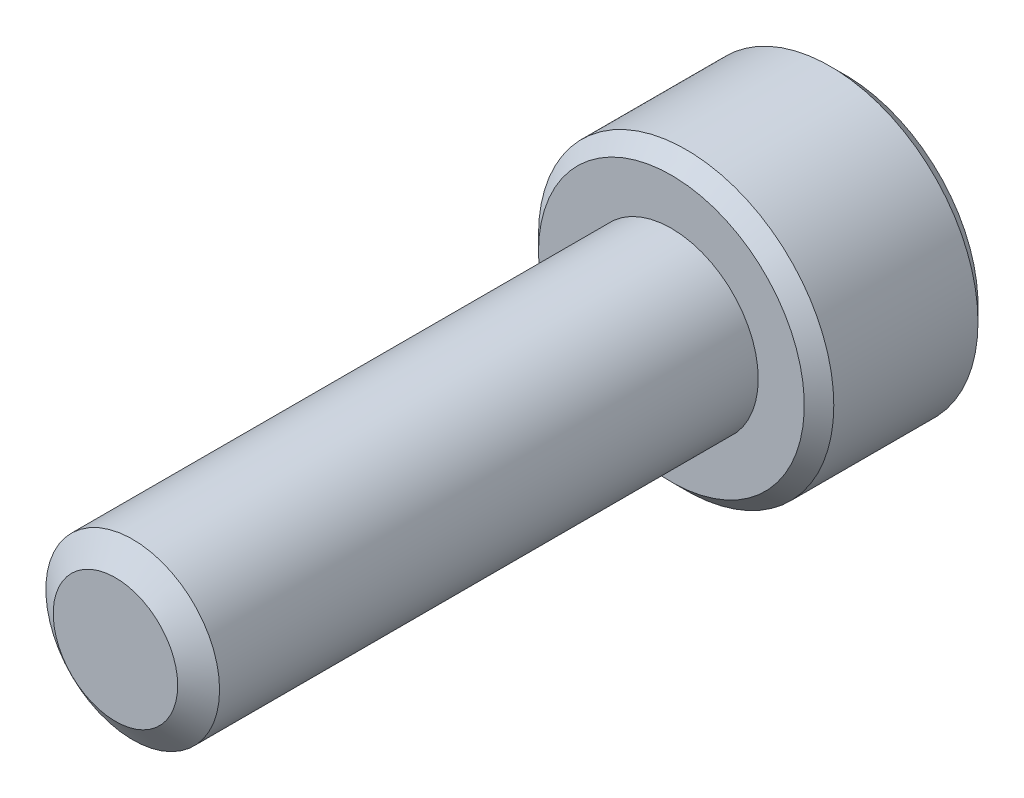
ISO-10303-21;
HEADER;
FILE_DESCRIPTION(('STEP AP214'),'2;1');
FILE_NAME('part.step','',(''),(''),'','','');
FILE_SCHEMA(('AUTOMOTIVE_DESIGN { 1 0 10303 214 1 1 1 1 }'));
ENDSEC;
DATA;
#1=APPLICATION_CONTEXT('core data for automotive mechanical design processes');
#2=APPLICATION_PROTOCOL_DEFINITION('international standard','automotive_design',2000,#1);
#3=PRODUCT_CONTEXT('',#1,'mechanical');
#4=PRODUCT('Part','Part','',(#3));
#5=PRODUCT_RELATED_PRODUCT_CATEGORY('part','',(#4));
#6=PRODUCT_DEFINITION_FORMATION('','',#4);
#7=PRODUCT_DEFINITION_CONTEXT('part definition',#1,'design');
#8=PRODUCT_DEFINITION('design','',#6,#7);
#9=PRODUCT_DEFINITION_SHAPE('','',#8);
#10=(LENGTH_UNIT() NAMED_UNIT(*) SI_UNIT(.MILLI.,.METRE.));
#11=(NAMED_UNIT(*) PLANE_ANGLE_UNIT() SI_UNIT($,.RADIAN.));
#12=(NAMED_UNIT(*) SI_UNIT($,.STERADIAN.) SOLID_ANGLE_UNIT());
#13=UNCERTAINTY_MEASURE_WITH_UNIT(LENGTH_MEASURE(1.E-05),#10,'distance_accuracy_value','');
#14=(GEOMETRIC_REPRESENTATION_CONTEXT(3) GLOBAL_UNCERTAINTY_ASSIGNED_CONTEXT((#13)) GLOBAL_UNIT_ASSIGNED_CONTEXT((#10,
#11,#12)) REPRESENTATION_CONTEXT('',''));
#15=CARTESIAN_POINT('',(0.,0.,0.));
#16=DIRECTION('',(0.,0.,1.));
#17=DIRECTION('',(1.,0.,0.));
#18=AXIS2_PLACEMENT_3D('',#15,#16,#17);
#19=CARTESIAN_POINT('',(0.,0.,-16.));
#20=DIRECTION('',(0.,0.,1.));
#21=DIRECTION('',(1.,0.,0.));
#22=AXIS2_PLACEMENT_3D('',#19,#20,#21);
#23=CYLINDRICAL_SURFACE('',#22,2.5);
#24=CARTESIAN_POINT('',(0.,0.,-16.));
#25=DIRECTION('',(0.,0.,-1.));
#26=DIRECTION('',(-1.,0.,0.));
#27=AXIS2_PLACEMENT_3D('',#24,#25,#26);
#28=CIRCLE('',#27,2.5);
#29=CARTESIAN_POINT('',(-2.5,0.,-16.));
#30=VERTEX_POINT('',#29);
#31=EDGE_CURVE('E212',#30,#30,#28,.F.);
#32=ORIENTED_EDGE('',*,*,#31,.T.);
#33=EDGE_LOOP('',(#32));
#34=FACE_BOUND('',#33,.T.);
#35=CARTESIAN_POINT('',(0.,0.,-0.496211410611025));
#36=DIRECTION('',(0.,0.,1.));
#37=DIRECTION('',(1.,0.,0.));
#38=AXIS2_PLACEMENT_3D('',#35,#36,#37);
#39=CIRCLE('',#38,2.5);
#40=CARTESIAN_POINT('',(2.5,0.,-0.496211410611025));
#41=VERTEX_POINT('',#40);
#42=EDGE_CURVE('E106',#41,#41,#39,.T.);
#43=ORIENTED_EDGE('',*,*,#42,.F.);
#44=EDGE_LOOP('',(#43));
#45=FACE_BOUND('',#44,.T.);
#46=ADVANCED_FACE('F32',(#34,#45),#23,.T.);
#47=CARTESIAN_POINT('',(0.,0.,0.));
#48=DIRECTION('',(0.,0.,-1.));
#49=DIRECTION('',(-1.,0.,0.));
#50=AXIS2_PLACEMENT_3D('',#47,#48,#49);
#51=CONICAL_SURFACE('',#50,1.79133666301317,0.959931088596884);
#52=ORIENTED_EDGE('',*,*,#42,.T.);
#53=EDGE_LOOP('',(#52));
#54=FACE_BOUND('',#53,.T.);
#55=CARTESIAN_POINT('',(0.,0.,0.));
#56=DIRECTION('',(0.,0.,1.));
#57=DIRECTION('',(1.,0.,0.));
#58=AXIS2_PLACEMENT_3D('',#55,#56,#57);
#59=CIRCLE('',#58,1.79133666301317);
#60=CARTESIAN_POINT('',(1.79133666301317,0.,0.));
#61=VERTEX_POINT('',#60);
#62=EDGE_CURVE('E210',#61,#61,#59,.T.);
#63=ORIENTED_EDGE('',*,*,#62,.F.);
#64=EDGE_LOOP('',(#63));
#65=FACE_BOUND('',#64,.T.);
#66=ADVANCED_FACE('F193',(#54,#65),#51,.T.);
#67=CARTESIAN_POINT('',(0.,0.,0.));
#68=DIRECTION('',(0.,0.,1.));
#69=DIRECTION('',(1.,0.,0.));
#70=AXIS2_PLACEMENT_3D('',#67,#68,#69);
#71=PLANE('',#70);
#72=ORIENTED_EDGE('',*,*,#62,.T.);
#73=EDGE_LOOP('',(#72));
#74=FACE_BOUND('',#73,.T.);
#75=ADVANCED_FACE('F190',(#74),#71,.T.);
#76=CARTESIAN_POINT('',(0.,0.,-21.));
#77=DIRECTION('',(0.,0.,1.));
#78=DIRECTION('',(1.,0.,0.));
#79=AXIS2_PLACEMENT_3D('',#76,#77,#78);
#80=CYLINDRICAL_SURFACE('',#79,4.25);
#81=CARTESIAN_POINT('',(0.,0.,-20.575));
#82=DIRECTION('',(0.,0.,-1.));
#83=DIRECTION('',(-1.,0.,0.));
#84=AXIS2_PLACEMENT_3D('',#81,#82,#83);
#85=CIRCLE('',#84,4.25);
#86=CARTESIAN_POINT('',(-4.25,0.,-20.575));
#87=VERTEX_POINT('',#86);
#88=EDGE_CURVE('E40',#87,#87,#85,.F.);
#89=ORIENTED_EDGE('',*,*,#88,.T.);
#90=EDGE_LOOP('',(#89));
#91=FACE_BOUND('',#90,.T.);
#92=CARTESIAN_POINT('',(0.,0.,-16.425));
#93=DIRECTION('',(0.,0.,-1.));
#94=DIRECTION('',(-1.,0.,0.));
#95=AXIS2_PLACEMENT_3D('',#92,#93,#94);
#96=CIRCLE('',#95,4.25);
#97=CARTESIAN_POINT('',(-4.25,0.,-16.425));
#98=VERTEX_POINT('',#97);
#99=EDGE_CURVE('E169',#98,#98,#96,.T.);
#100=ORIENTED_EDGE('',*,*,#99,.T.);
#101=EDGE_LOOP('',(#100));
#102=FACE_BOUND('',#101,.T.);
#103=ADVANCED_FACE('F174',(#91,#102),#80,.T.);
#104=CARTESIAN_POINT('',(0.,0.,-21.));
#105=DIRECTION('',(0.,0.,-1.));
#106=DIRECTION('',(-1.,0.,0.));
#107=AXIS2_PLACEMENT_3D('',#104,#105,#106);
#108=PLANE('',#107);
#109=CARTESIAN_POINT('',(0.,0.,-21.));
#110=DIRECTION('',(0.,0.,-1.));
#111=DIRECTION('',(-1.,0.,0.));
#112=AXIS2_PLACEMENT_3D('',#109,#110,#111);
#113=CIRCLE('',#112,3.82500000000001);
#114=CARTESIAN_POINT('',(-3.82500000000001,0.,-21.));
#115=VERTEX_POINT('',#114);
#116=EDGE_CURVE('E105',#115,#115,#113,.T.);
#117=ORIENTED_EDGE('',*,*,#116,.T.);
#118=EDGE_LOOP('',(#117));
#119=FACE_BOUND('',#118,.T.);
#120=CARTESIAN_POINT('',(0.,0.,-21.));
#121=DIRECTION('',(0.,0.,-1.));
#122=DIRECTION('',(-1.,0.,0.));
#123=AXIS2_PLACEMENT_3D('',#120,#121,#122);
#124=CIRCLE('',#123,2.3094010767585);
#125=CARTESIAN_POINT('',(-2.,1.15470053837925,-21.));
#126=VERTEX_POINT('',#125);
#127=CARTESIAN_POINT('',(0.,2.3094010767585,-21.));
#128=VERTEX_POINT('',#127);
#129=EDGE_CURVE('E86',#126,#128,#124,.T.);
#130=ORIENTED_EDGE('',*,*,#129,.F.);
#131=CARTESIAN_POINT('',(-2.,-1.15470053837925,-21.));
#132=VERTEX_POINT('',#131);
#133=EDGE_CURVE('E46',#132,#126,#124,.T.);
#134=ORIENTED_EDGE('',*,*,#133,.F.);
#135=CARTESIAN_POINT('',(0.,-2.3094010767585,-21.));
#136=VERTEX_POINT('',#135);
#137=EDGE_CURVE('E271',#136,#132,#124,.T.);
#138=ORIENTED_EDGE('',*,*,#137,.F.);
#139=CARTESIAN_POINT('',(2.,-1.15470053837925,-21.));
#140=VERTEX_POINT('',#139);
#141=EDGE_CURVE('E53',#140,#136,#124,.T.);
#142=ORIENTED_EDGE('',*,*,#141,.F.);
#143=CARTESIAN_POINT('',(2.,1.15470053837925,-21.));
#144=VERTEX_POINT('',#143);
#145=EDGE_CURVE('E127',#144,#140,#124,.T.);
#146=ORIENTED_EDGE('',*,*,#145,.F.);
#147=EDGE_CURVE('E95',#128,#144,#124,.T.);
#148=ORIENTED_EDGE('',*,*,#147,.F.);
#149=EDGE_LOOP('',(#130,#134,#138,#142,#146,#148));
#150=FACE_BOUND('',#149,.T.);
#151=ADVANCED_FACE('F126',(#119,#150),#108,.T.);
#152=CARTESIAN_POINT('',(0.,0.,-16.));
#153=DIRECTION('',(0.,0.,-1.));
#154=DIRECTION('',(-1.,0.,0.));
#155=AXIS2_PLACEMENT_3D('',#152,#153,#154);
#156=PLANE('',#155);
#157=CARTESIAN_POINT('',(0.,0.,-16.));
#158=DIRECTION('',(0.,0.,-1.));
#159=DIRECTION('',(-1.,0.,0.));
#160=AXIS2_PLACEMENT_3D('',#157,#158,#159);
#161=CIRCLE('',#160,3.825);
#162=CARTESIAN_POINT('',(-3.825,0.,-16.));
#163=VERTEX_POINT('',#162);
#164=EDGE_CURVE('E11',#163,#163,#161,.F.);
#165=ORIENTED_EDGE('',*,*,#164,.T.);
#166=EDGE_LOOP('',(#165));
#167=FACE_BOUND('',#166,.T.);
#168=ORIENTED_EDGE('',*,*,#31,.F.);
#169=EDGE_LOOP('',(#168));
#170=FACE_BOUND('',#169,.T.);
#171=ADVANCED_FACE('F183',(#167,#170),#156,.F.);
#172=CARTESIAN_POINT('',(0.,0.,-21.));
#173=DIRECTION('',(0.,0.,-1.));
#174=DIRECTION('',(-1.,0.,0.));
#175=AXIS2_PLACEMENT_3D('',#172,#173,#174);
#176=CONICAL_SURFACE('',#175,2.3094010767585,0.78539816339745);
#177=ORIENTED_EDGE('',*,*,#147,.T.);
#178=CARTESIAN_POINT('',(-0.000199999999999456,2.30951654681234,-21.0001154787137));
#179=CARTESIAN_POINT('',(0.0685530340307063,2.26982196410711,-20.9604530902256));
#180=CARTESIAN_POINT('',(0.138455742135513,2.22946361676571,-20.9231199822842));
#181=CARTESIAN_POINT('',(0.280995244550437,2.1471683966763,-20.8547636851361));
#182=CARTESIAN_POINT('',(0.353645597565359,2.10522369580642,-20.8237785337372));
#183=CARTESIAN_POINT('',(0.500141601053971,2.02064418875706,-20.7707002165441));
#184=CARTESIAN_POINT('',(0.573949935246294,1.97803092714269,-20.7484736271766));
#185=CARTESIAN_POINT('',(0.723191631835263,1.89186619344273,-20.7142288166751));
#186=CARTESIAN_POINT('',(0.79862043391815,1.84831735425552,-20.7021850291441));
#187=CARTESIAN_POINT('',(0.928615500671078,1.7732646674724,-20.6913185119056));
#188=CARTESIAN_POINT('',(0.983013783970107,1.74185780396625,-20.68970975361));
#189=CARTESIAN_POINT('',(1.09172145551969,1.67909540053412,-20.6924188775987));
#190=CARTESIAN_POINT('',(1.14603080592134,1.64773988246021,-20.696738837758));
#191=CARTESIAN_POINT('',(1.25413672758934,1.5853248994842,-20.7110595674099));
#192=CARTESIAN_POINT('',(1.30793265655479,1.55426580541469,-20.721066692762));
#193=CARTESIAN_POINT('',(1.41459426230557,1.49268469862228,-20.7462124302497));
#194=CARTESIAN_POINT('',(1.46746001007071,1.46216264491917,-20.7613506490422));
#195=CARTESIAN_POINT('',(1.60287973308984,1.38397803138049,-20.8062945034292));
#196=CARTESIAN_POINT('',(1.68459383484948,1.33680037273297,-20.8394888394258));
#197=CARTESIAN_POINT('',(1.8047470372578,1.26742988897853,-20.8955258231714));
#198=CARTESIAN_POINT('',(1.84434285210918,1.24456923461531,-20.9152147029469));
#199=CARTESIAN_POINT('',(1.92280095888787,1.19927142554652,-20.9563873183649));
#200=CARTESIAN_POINT('',(1.96166368359374,1.17683402097614,-20.9778699516512));
#201=CARTESIAN_POINT('',(2.0002,1.15458506832541,-21.0001154787137));
#202=B_SPLINE_CURVE_WITH_KNOTS('',3,(#178,#179,#180,#181,#182,#183,#184,#185,#186,#187,#188,
#189,#190,#191,#192,#193,#194,#195,#196,#197,#198,#199,#200,#201),.UNSPECIFIED.,.F.,.F.,(4,2,2,
2,2,2,2,2,2,2,2,4),(0.,0.266420613771064,0.534393751523387,0.798110374376911,1.06116288956936,
1.24939906803721,1.43770123566247,1.62621426093931,1.81471283831913,2.11415604834144,
2.2634717071779,2.41269626969771),.UNSPECIFIED.);
#203=EDGE_CURVE('E100',#128,#144,#202,.T.);
#204=ORIENTED_EDGE('',*,*,#203,.F.);
#205=EDGE_LOOP('',(#177,#204));
#206=FACE_BOUND('',#205,.T.);
#207=ADVANCED_FACE('F101',(#206),#176,.F.);
#208=ORIENTED_EDGE('',*,*,#145,.T.);
#209=CARTESIAN_POINT('',(2.,-2.30294417292923,-21.7407713550277));
#210=CARTESIAN_POINT('',(2.,-2.24687002663712,-21.698443273626));
#211=CARTESIAN_POINT('',(2.,-2.19048190536959,-21.6565251568643));
#212=CARTESIAN_POINT('',(2.,-2.07695390496424,-21.573690417861));
#213=CARTESIAN_POINT('',(2.,-2.01981384066454,-21.5327740496681));
#214=CARTESIAN_POINT('',(2.,-1.90424016804776,-21.4518334520186));
#215=CARTESIAN_POINT('',(2.,-1.8457999674391,-21.4118185915599));
#216=CARTESIAN_POINT('',(2.,-1.7279274546176,-21.3332889936643));
#217=CARTESIAN_POINT('',(2.,-1.66849521292324,-21.2947741502431));
#218=CARTESIAN_POINT('',(2.,-1.4816299571002,-21.1776406516043));
#219=CARTESIAN_POINT('',(2.,-1.35220318163536,-21.1021459017296));
#220=CARTESIAN_POINT('',(2.,-1.08689521592924,-20.9640493509944));
#221=CARTESIAN_POINT('',(2.,-0.95103776393819,-20.9014040859035));
#222=CARTESIAN_POINT('',(2.,-0.747111912259407,-20.8247635438751));
#223=CARTESIAN_POINT('',(2.,-0.682064034147874,-20.8027671799191));
#224=CARTESIAN_POINT('',(2.,-0.55039810329475,-20.7639966876601));
#225=CARTESIAN_POINT('',(2.,-0.483779942722474,-20.7472229191212));
#226=CARTESIAN_POINT('',(2.,-0.350484328847653,-20.7200482578844));
#227=CARTESIAN_POINT('',(2.,-0.283829489364783,-20.7095381767417));
#228=CARTESIAN_POINT('',(2.,-0.149806987139374,-20.6950960855449));
#229=CARTESIAN_POINT('',(2.,-0.0824394489341194,-20.6911629447331));
#230=CARTESIAN_POINT('',(2.,0.0499055622944926,-20.6901664769337));
#231=CARTESIAN_POINT('',(2.,0.114881285143175,-20.6928596448504));
#232=CARTESIAN_POINT('',(2.,0.244275921482763,-20.7044300704227));
#233=CARTESIAN_POINT('',(2.,0.308694780266756,-20.7133079288332));
#234=CARTESIAN_POINT('',(2.,0.437599788610707,-20.7369136592962));
#235=CARTESIAN_POINT('',(2.,0.502067428644597,-20.7517410834465));
#236=CARTESIAN_POINT('',(2.,0.629594322598307,-20.786457883628));
#237=CARTESIAN_POINT('',(2.,0.692653693883152,-20.8063468361063));
#238=CARTESIAN_POINT('',(2.,0.891187889210546,-20.8764469792562));
#239=CARTESIAN_POINT('',(2.,1.02383545707306,-20.9346418003215));
#240=CARTESIAN_POINT('',(2.,1.28290932150074,-21.0640305754596));
#241=CARTESIAN_POINT('',(2.,1.40931112587571,-21.1352712314148));
#242=CARTESIAN_POINT('',(2.,1.59200441438963,-21.2464419918747));
#243=CARTESIAN_POINT('',(2.,1.65027549026191,-21.2831821903374));
#244=CARTESIAN_POINT('',(2.,1.76581760389243,-21.3582145141838));
#245=CARTESIAN_POINT('',(2.,1.82308856543105,-21.396506757118));
#246=CARTESIAN_POINT('',(2.,1.93629654762084,-21.4740422640812));
#247=CARTESIAN_POINT('',(2.,1.99224062500539,-21.5132752761336));
#248=CARTESIAN_POINT('',(2.,2.103364240299,-21.5927788307365));
#249=CARTESIAN_POINT('',(2.,2.15854398422469,-21.6330490850006));
#250=CARTESIAN_POINT('',(2.,2.21340370692659,-21.6737442381459));
#251=B_SPLINE_CURVE_WITH_KNOTS('',3,(#209,#210,#211,#212,#213,#214,#215,#216,#217,#218,#219,
#220,#221,#222,#223,#224,#225,#226,#227,#228,#229,#230,#231,#232,#233,#234,#235,#236,#237,#238,
#239,#240,#241,#242,#243,#244,#245,#246,#247,#248,#249,#250),.UNSPECIFIED.,.F.,.F.,(4,2,2,2,2,2,
2,2,2,2,2,2,2,2,2,2,2,2,2,2,4),(0.,0.210772731976891,0.421598374658589,0.634057554623487,
0.846501695870171,1.29562155455624,1.74319622821645,1.94902062110207,2.15485918928326,
2.35699582502635,2.5590977043214,2.75388435553556,2.94868993014815,3.14690093452586,
3.34509535789702,3.77838155837653,4.21325029921625,4.41989056685647,4.62654651460921,
4.8315237711129,5.03644465914085),.UNSPECIFIED.);
#252=EDGE_CURVE('E94',#144,#140,#251,.F.);
#253=ORIENTED_EDGE('',*,*,#252,.F.);
#254=EDGE_LOOP('',(#208,#253));
#255=FACE_BOUND('',#254,.T.);
#256=ADVANCED_FACE('F277',(#255),#176,.F.);
#257=ORIENTED_EDGE('',*,*,#141,.T.);
#258=CARTESIAN_POINT('',(2.0002,-1.15458506832541,-21.0001154787137));
#259=CARTESIAN_POINT('',(1.93144696596929,-1.19427965103064,-20.9604530902256));
#260=CARTESIAN_POINT('',(1.86154425786449,-1.23463799837204,-20.9231199822842));
#261=CARTESIAN_POINT('',(1.71900475544956,-1.31693321846145,-20.8547636851361));
#262=CARTESIAN_POINT('',(1.64635440243464,-1.35887791933134,-20.8237785337372));
#263=CARTESIAN_POINT('',(1.49985839894603,-1.44345742638069,-20.7707002165441));
#264=CARTESIAN_POINT('',(1.42605006475371,-1.48607068799507,-20.7484736271766));
#265=CARTESIAN_POINT('',(1.27680836816474,-1.57223542169503,-20.7142288166751));
#266=CARTESIAN_POINT('',(1.20137956608185,-1.61578426088223,-20.7021850291441));
#267=CARTESIAN_POINT('',(1.07138449932892,-1.69083694766536,-20.6913185119056));
#268=CARTESIAN_POINT('',(1.01698621602989,-1.72224381117151,-20.68970975361));
#269=CARTESIAN_POINT('',(0.908278544480308,-1.78500621460364,-20.6924188775987));
#270=CARTESIAN_POINT('',(0.853969194078662,-1.81636173267754,-20.696738837758));
#271=CARTESIAN_POINT('',(0.745863272410663,-1.87877671565355,-20.7110595674099));
#272=CARTESIAN_POINT('',(0.692067343445209,-1.90983580972306,-20.721066692762));
#273=CARTESIAN_POINT('',(0.585405737694428,-1.97141691651547,-20.7462124302497));
#274=CARTESIAN_POINT('',(0.532539989929289,-2.00193897021859,-20.7613506490422));
#275=CARTESIAN_POINT('',(0.397120266910156,-2.08012358375727,-20.8062945034292));
#276=CARTESIAN_POINT('',(0.315406165150522,-2.12730124240478,-20.8394888394258));
#277=CARTESIAN_POINT('',(0.195252962742198,-2.19667172615922,-20.8955258231714));
#278=CARTESIAN_POINT('',(0.155657147890823,-2.21953238052245,-20.9152147029469));
#279=CARTESIAN_POINT('',(0.0771990411121276,-2.26483018959124,-20.9563873183649));
#280=CARTESIAN_POINT('',(0.0383363164062597,-2.28726759416161,-20.9778699516512));
#281=CARTESIAN_POINT('',(-0.000199999999999433,-2.30951654681234,-21.0001154787137));
#282=B_SPLINE_CURVE_WITH_KNOTS('',3,(#258,#259,#260,#261,#262,#263,#264,#265,#266,#267,#268,
#269,#270,#271,#272,#273,#274,#275,#276,#277,#278,#279,#280,#281),.UNSPECIFIED.,.F.,.F.,(4,2,2,
2,2,2,2,2,2,2,2,4),(0.,0.266420613771063,0.534393751523389,0.798110374376914,1.06116288956936,
1.24939906803722,1.43770123566247,1.62621426093932,1.81471283831913,2.11415604834145,
2.26347170717791,2.41269626969771),.UNSPECIFIED.);
#283=EDGE_CURVE('E137',#140,#136,#282,.T.);
#284=ORIENTED_EDGE('',*,*,#283,.F.);
#285=EDGE_LOOP('',(#257,#284));
#286=FACE_BOUND('',#285,.T.);
#287=ADVANCED_FACE('F274',(#286),#176,.F.);
#288=ORIENTED_EDGE('',*,*,#137,.T.);
#289=CARTESIAN_POINT('',(0.00020000000000056,-2.30951654681234,-21.0001154787137));
#290=CARTESIAN_POINT('',(-0.0685530340307054,-2.26982196410711,-20.9604530902256));
#291=CARTESIAN_POINT('',(-0.138455742135511,-2.22946361676572,-20.9231199822842));
#292=CARTESIAN_POINT('',(-0.280995244550436,-2.1471683966763,-20.8547636851361));
#293=CARTESIAN_POINT('',(-0.353645597565358,-2.10522369580642,-20.8237785337372));
#294=CARTESIAN_POINT('',(-0.50014160105397,-2.02064418875706,-20.7707002165441));
#295=CARTESIAN_POINT('',(-0.573949935246293,-1.97803092714269,-20.7484736271766));
#296=CARTESIAN_POINT('',(-0.723191631835262,-1.89186619344273,-20.7142288166751));
#297=CARTESIAN_POINT('',(-0.79862043391815,-1.84831735425552,-20.7021850291441));
#298=CARTESIAN_POINT('',(-0.928615500671077,-1.7732646674724,-20.6913185119056));
#299=CARTESIAN_POINT('',(-0.983013783970107,-1.74185780396625,-20.68970975361));
#300=CARTESIAN_POINT('',(-1.09172145551969,-1.67909540053412,-20.6924188775987));
#301=CARTESIAN_POINT('',(-1.14603080592134,-1.64773988246022,-20.696738837758));
#302=CARTESIAN_POINT('',(-1.25413672758934,-1.5853248994842,-20.7110595674099));
#303=CARTESIAN_POINT('',(-1.30793265655479,-1.55426580541469,-20.721066692762));
#304=CARTESIAN_POINT('',(-1.41459426230557,-1.49268469862228,-20.7462124302497));
#305=CARTESIAN_POINT('',(-1.46746001007071,-1.46216264491917,-20.7613506490422));
#306=CARTESIAN_POINT('',(-1.60287973308984,-1.38397803138049,-20.8062945034292));
#307=CARTESIAN_POINT('',(-1.68459383484948,-1.33680037273297,-20.8394888394258));
#308=CARTESIAN_POINT('',(-1.8047470372578,-1.26742988897853,-20.8955258231714));
#309=CARTESIAN_POINT('',(-1.84434285210918,-1.24456923461531,-20.9152147029469));
#310=CARTESIAN_POINT('',(-1.92280095888787,-1.19927142554652,-20.9563873183649));
#311=CARTESIAN_POINT('',(-1.96166368359374,-1.17683402097614,-20.9778699516512));
#312=CARTESIAN_POINT('',(-2.0002,-1.15458506832541,-21.0001154787137));
#313=B_SPLINE_CURVE_WITH_KNOTS('',3,(#289,#290,#291,#292,#293,#294,#295,#296,#297,#298,#299,
#300,#301,#302,#303,#304,#305,#306,#307,#308,#309,#310,#311,#312),.UNSPECIFIED.,.F.,.F.,(4,2,2,
2,2,2,2,2,2,2,2,4),(0.,0.266420613771064,0.534393751523389,0.798110374376913,1.06116288956936,
1.24939906803721,1.43770123566247,1.62621426093931,1.81471283831913,2.11415604834145,
2.2634717071779,2.41269626969771),.UNSPECIFIED.);
#314=EDGE_CURVE('E248',#136,#132,#313,.T.);
#315=ORIENTED_EDGE('',*,*,#314,.F.);
#316=EDGE_LOOP('',(#288,#315));
#317=FACE_BOUND('',#316,.T.);
#318=ADVANCED_FACE('F273',(#317),#176,.F.);
#319=ORIENTED_EDGE('',*,*,#133,.T.);
#320=CARTESIAN_POINT('',(-2.,-2.3029441732643,-21.7407713552807));
#321=CARTESIAN_POINT('',(-2.,-2.24687002696278,-21.6984432738692));
#322=CARTESIAN_POINT('',(-2.,-2.19048190568582,-21.6565251570978));
#323=CARTESIAN_POINT('',(-2.,-2.07695390526152,-21.5736904180751));
#324=CARTESIAN_POINT('',(-2.,-2.01981384095229,-21.5327740498725));
#325=CARTESIAN_POINT('',(-2.,-1.90424016831613,-21.4518334522036));
#326=CARTESIAN_POINT('',(-2.,-1.84579996769763,-21.4118185917352));
#327=CARTESIAN_POINT('',(-2.,-1.72792745485625,-21.3332889938203));
#328=CARTESIAN_POINT('',(-2.,-1.66849521315186,-21.2947741503895));
#329=CARTESIAN_POINT('',(-2.,-1.48162995729573,-21.1776406517203));
#330=CARTESIAN_POINT('',(-2.,-1.35220318180736,-21.1021459018253));
#331=CARTESIAN_POINT('',(-2.,-1.08689521605219,-20.9640493510523));
#332=CARTESIAN_POINT('',(-2.,-0.951037764035625,-20.901404085944));
#333=CARTESIAN_POINT('',(-2.,-0.747111912337646,-20.8247635439028));
#334=CARTESIAN_POINT('',(-2.,-0.682064034234151,-20.8027671799472));
#335=CARTESIAN_POINT('',(-2.,-0.550398103397367,-20.7639966876876));
#336=CARTESIAN_POINT('',(-2.,-0.483779942833392,-20.7472229191476));
#337=CARTESIAN_POINT('',(-2.,-0.3504843289749,-20.7200482579067));
#338=CARTESIAN_POINT('',(-2.,-0.283829489500055,-20.709538176761));
#339=CARTESIAN_POINT('',(-2.,-0.149806987290425,-20.6950960855565));
#340=CARTESIAN_POINT('',(-2.,-0.0824394490929252,-20.6911629447399));
#341=CARTESIAN_POINT('',(-2.,0.0499055621213776,-20.6901664769296));
#342=CARTESIAN_POINT('',(-2.,0.114881284963486,-20.6928596448403));
#343=CARTESIAN_POINT('',(-2.,0.244275921290585,-20.7044300703996));
#344=CARTESIAN_POINT('',(-2.,0.308694780068662,-20.7133079288031));
#345=CARTESIAN_POINT('',(-2.,0.437599788400935,-20.7369136592514));
#346=CARTESIAN_POINT('',(-2.,0.50206742842908,-20.7517410833941));
#347=CARTESIAN_POINT('',(-2.,0.629594322371856,-20.78645788356));
#348=CARTESIAN_POINT('',(-2.,0.69265369365151,-20.8063468360305));
#349=CARTESIAN_POINT('',(-2.,0.891187888928464,-20.8764469791434));
#350=CARTESIAN_POINT('',(-2.,1.02383545674826,-20.9346418001747));
#351=CARTESIAN_POINT('',(-2.,1.28290932109378,-21.0640305752409));
#352=CARTESIAN_POINT('',(-2.,1.40931112542932,-21.1352712311583));
#353=CARTESIAN_POINT('',(-2.,1.59200441388854,-21.2464419915627));
#354=CARTESIAN_POINT('',(-2.,1.65027548974481,-21.2831821900083));
#355=CARTESIAN_POINT('',(-2.,1.76581760334354,-21.3582145138205));
#356=CARTESIAN_POINT('',(-2.,1.82308856486638,-21.3965067567377));
#357=CARTESIAN_POINT('',(-2.,1.93629654702499,-21.4740422636668));
#358=CARTESIAN_POINT('',(-2.,1.99224062439414,-21.5132752757022));
#359=CARTESIAN_POINT('',(-2.,2.10336423965704,-21.5927788302713));
#360=CARTESIAN_POINT('',(-2.,2.15854398356743,-21.6330490845185));
#361=CARTESIAN_POINT('',(-2.,2.21340370625406,-21.6737442376469));
#362=B_SPLINE_CURVE_WITH_KNOTS('',3,(#320,#321,#322,#323,#324,#325,#326,#327,#328,#329,#330,
#331,#332,#333,#334,#335,#336,#337,#338,#339,#340,#341,#342,#343,#344,#345,#346,#347,#348,#349,
#350,#351,#352,#353,#354,#355,#356,#357,#358,#359,#360,#361),.UNSPECIFIED.,.F.,.F.,(4,2,2,2,2,2,
2,2,2,2,2,2,2,2,2,2,2,2,2,2,4),(0.,0.210772732017009,0.421598374738837,0.634057554744618,
0.846501696032178,1.29562155480993,1.74319622856096,1.94902062142334,2.15485918958132,
2.35699582530216,2.55909770457495,2.75388435576874,2.94868993036093,3.14690093471669,
3.34509535806591,3.77838155838771,4.21325029906866,4.41989056664096,4.62654651432578,
4.83152377076247,5.03644465872344),.UNSPECIFIED.);
#363=EDGE_CURVE('E116',#132,#126,#362,.T.);
#364=ORIENTED_EDGE('',*,*,#363,.F.);
#365=EDGE_LOOP('',(#319,#364));
#366=FACE_BOUND('',#365,.T.);
#367=ADVANCED_FACE('F286',(#366),#176,.F.);
#368=ORIENTED_EDGE('',*,*,#129,.T.);
#369=CARTESIAN_POINT('',(-2.0002,1.15458506832541,-21.0001154787137));
#370=CARTESIAN_POINT('',(-1.93144696596929,1.19427965103064,-20.9604530902256));
#371=CARTESIAN_POINT('',(-1.86154425786449,1.23463799837204,-20.9231199822842));
#372=CARTESIAN_POINT('',(-1.71900475544956,1.31693321846145,-20.8547636851361));
#373=CARTESIAN_POINT('',(-1.64635440243464,1.35887791933134,-20.8237785337372));
#374=CARTESIAN_POINT('',(-1.49985839894603,1.44345742638069,-20.7707002165441));
#375=CARTESIAN_POINT('',(-1.42605006475371,1.48607068799507,-20.7484736271766));
#376=CARTESIAN_POINT('',(-1.27680836816474,1.57223542169503,-20.7142288166751));
#377=CARTESIAN_POINT('',(-1.20137956608185,1.61578426088223,-20.7021850291441));
#378=CARTESIAN_POINT('',(-1.07138449932892,1.69083694766536,-20.6913185119056));
#379=CARTESIAN_POINT('',(-1.01698621602989,1.72224381117151,-20.68970975361));
#380=CARTESIAN_POINT('',(-0.908278544480308,1.78500621460364,-20.6924188775987));
#381=CARTESIAN_POINT('',(-0.853969194078662,1.81636173267754,-20.696738837758));
#382=CARTESIAN_POINT('',(-0.745863272410663,1.87877671565355,-20.7110595674099));
#383=CARTESIAN_POINT('',(-0.692067343445209,1.90983580972306,-20.721066692762));
#384=CARTESIAN_POINT('',(-0.585405737694428,1.97141691651547,-20.7462124302497));
#385=CARTESIAN_POINT('',(-0.532539989929288,2.00193897021859,-20.7613506490422));
#386=CARTESIAN_POINT('',(-0.397120266910157,2.08012358375727,-20.8062945034292));
#387=CARTESIAN_POINT('',(-0.315406165150521,2.12730124240478,-20.8394888394258));
#388=CARTESIAN_POINT('',(-0.195252962742198,2.19667172615922,-20.8955258231714));
#389=CARTESIAN_POINT('',(-0.155657147890824,2.21953238052245,-20.9152147029469));
#390=CARTESIAN_POINT('',(-0.0771990411121297,2.26483018959123,-20.9563873183649));
#391=CARTESIAN_POINT('',(-0.0383363164062612,2.28726759416161,-20.9778699516512));
#392=CARTESIAN_POINT('',(0.000199999999999579,2.30951654681234,-21.0001154787137));
#393=B_SPLINE_CURVE_WITH_KNOTS('',3,(#369,#370,#371,#372,#373,#374,#375,#376,#377,#378,#379,
#380,#381,#382,#383,#384,#385,#386,#387,#388,#389,#390,#391,#392),.UNSPECIFIED.,.F.,.F.,(4,2,2,
2,2,2,2,2,2,2,2,4),(0.,0.266420613771062,0.534393751523389,0.798110374376914,1.06116288956936,
1.24939906803722,1.43770123566247,1.62621426093932,1.81471283831913,2.11415604834145,
2.2634717071779,2.41269626969771),.UNSPECIFIED.);
#394=EDGE_CURVE('E90',#126,#128,#393,.T.);
#395=ORIENTED_EDGE('',*,*,#394,.F.);
#396=EDGE_LOOP('',(#368,#395));
#397=FACE_BOUND('',#396,.T.);
#398=ADVANCED_FACE('F88',(#397),#176,.F.);
#399=CARTESIAN_POINT('',(2.,3.46410161513775,-18.));
#400=DIRECTION('',(0.,0.,-1.));
#401=DIRECTION('',(-1.,0.,0.));
#402=AXIS2_PLACEMENT_3D('',#399,#400,#401);
#403=PLANE('',#402);
#404=DIRECTION('',(0.866025403784439,0.5,0.));
#405=VECTOR('',#404,1.);
#406=CARTESIAN_POINT('',(-2.,1.15470053837925,-18.));
#407=LINE('',#406,#405);
#408=CARTESIAN_POINT('',(-2.,1.15470053837925,-18.));
#409=VERTEX_POINT('',#408);
#410=CARTESIAN_POINT('',(0.,2.3094010767585,-18.));
#411=VERTEX_POINT('',#410);
#412=EDGE_CURVE('E115',#409,#411,#407,.T.);
#413=ORIENTED_EDGE('',*,*,#412,.T.);
#414=DIRECTION('',(0.866025403784439,-0.5,0.));
#415=VECTOR('',#414,1.);
#416=CARTESIAN_POINT('',(0.,2.3094010767585,-18.));
#417=LINE('',#416,#415);
#418=CARTESIAN_POINT('',(2.,1.15470053837925,-18.));
#419=VERTEX_POINT('',#418);
#420=EDGE_CURVE('E120',#411,#419,#417,.T.);
#421=ORIENTED_EDGE('',*,*,#420,.T.);
#422=DIRECTION('',(0.,-1.,0.));
#423=VECTOR('',#422,1.);
#424=CARTESIAN_POINT('',(2.,1.15470053837925,-18.));
#425=LINE('',#424,#423);
#426=CARTESIAN_POINT('',(2.,-1.15470053837925,-18.));
#427=VERTEX_POINT('',#426);
#428=EDGE_CURVE('E234',#419,#427,#425,.T.);
#429=ORIENTED_EDGE('',*,*,#428,.T.);
#430=DIRECTION('',(-0.866025403784439,-0.5,0.));
#431=VECTOR('',#430,1.);
#432=CARTESIAN_POINT('',(2.,-1.15470053837925,-18.));
#433=LINE('',#432,#431);
#434=CARTESIAN_POINT('',(0.,-2.3094010767585,-18.));
#435=VERTEX_POINT('',#434);
#436=EDGE_CURVE('E231',#427,#435,#433,.T.);
#437=ORIENTED_EDGE('',*,*,#436,.T.);
#438=DIRECTION('',(-0.866025403784439,0.5,0.));
#439=VECTOR('',#438,1.);
#440=CARTESIAN_POINT('',(0.,-2.3094010767585,-18.));
#441=LINE('',#440,#439);
#442=CARTESIAN_POINT('',(-2.,-1.15470053837925,-18.));
#443=VERTEX_POINT('',#442);
#444=EDGE_CURVE('E228',#435,#443,#441,.T.);
#445=ORIENTED_EDGE('',*,*,#444,.T.);
#446=DIRECTION('',(0.,1.,0.));
#447=VECTOR('',#446,1.);
#448=CARTESIAN_POINT('',(-2.,-1.15470053837925,-18.));
#449=LINE('',#448,#447);
#450=EDGE_CURVE('E123',#443,#409,#449,.T.);
#451=ORIENTED_EDGE('',*,*,#450,.T.);
#452=EDGE_LOOP('',(#413,#421,#429,#437,#445,#451));
#453=FACE_BOUND('',#452,.T.);
#454=ADVANCED_FACE('F157',(#453),#403,.T.);
#455=CARTESIAN_POINT('',(0.,2.3094010767585,-18.));
#456=DIRECTION('',(0.5,0.866025403784439,0.));
#457=DIRECTION('',(-0.866025403784439,0.5,0.));
#458=AXIS2_PLACEMENT_3D('',#455,#456,#457);
#459=PLANE('',#458);
#460=DIRECTION('',(0.,0.,-1.));
#461=VECTOR('',#460,1.);
#462=CARTESIAN_POINT('',(0.,2.3094010767585,-18.));
#463=LINE('',#462,#461);
#464=EDGE_CURVE('E112',#411,#128,#463,.T.);
#465=ORIENTED_EDGE('',*,*,#464,.T.);
#466=ORIENTED_EDGE('',*,*,#203,.T.);
#467=DIRECTION('',(0.,0.,-1.));
#468=VECTOR('',#467,1.);
#469=CARTESIAN_POINT('',(2.,1.15470053837925,-18.));
#470=LINE('',#469,#468);
#471=EDGE_CURVE('E122',#419,#144,#470,.T.);
#472=ORIENTED_EDGE('',*,*,#471,.F.);
#473=ORIENTED_EDGE('',*,*,#420,.F.);
#474=EDGE_LOOP('',(#465,#466,#472,#473));
#475=FACE_BOUND('',#474,.T.);
#476=ADVANCED_FACE('F118',(#475),#459,.F.);
#477=CARTESIAN_POINT('',(2.,1.15470053837925,-18.));
#478=DIRECTION('',(1.,0.,0.));
#479=DIRECTION('',(0.,0.,-1.));
#480=AXIS2_PLACEMENT_3D('',#477,#478,#479);
#481=PLANE('',#480);
#482=ORIENTED_EDGE('',*,*,#471,.T.);
#483=ORIENTED_EDGE('',*,*,#252,.T.);
#484=DIRECTION('',(0.,0.,-1.));
#485=VECTOR('',#484,1.);
#486=CARTESIAN_POINT('',(2.,-1.15470053837925,-18.));
#487=LINE('',#486,#485);
#488=EDGE_CURVE('E217',#427,#140,#487,.T.);
#489=ORIENTED_EDGE('',*,*,#488,.F.);
#490=ORIENTED_EDGE('',*,*,#428,.F.);
#491=EDGE_LOOP('',(#482,#483,#489,#490));
#492=FACE_BOUND('',#491,.T.);
#493=ADVANCED_FACE('F146',(#492),#481,.F.);
#494=CARTESIAN_POINT('',(2.,-1.15470053837925,-18.));
#495=DIRECTION('',(0.5,-0.866025403784439,0.));
#496=DIRECTION('',(0.866025403784439,0.5,0.));
#497=AXIS2_PLACEMENT_3D('',#494,#495,#496);
#498=PLANE('',#497);
#499=ORIENTED_EDGE('',*,*,#488,.T.);
#500=ORIENTED_EDGE('',*,*,#283,.T.);
#501=DIRECTION('',(0.,0.,-1.));
#502=VECTOR('',#501,1.);
#503=CARTESIAN_POINT('',(0.,-2.3094010767585,-18.));
#504=LINE('',#503,#502);
#505=EDGE_CURVE('E220',#435,#136,#504,.T.);
#506=ORIENTED_EDGE('',*,*,#505,.F.);
#507=ORIENTED_EDGE('',*,*,#436,.F.);
#508=EDGE_LOOP('',(#499,#500,#506,#507));
#509=FACE_BOUND('',#508,.T.);
#510=ADVANCED_FACE('F150',(#509),#498,.F.);
#511=CARTESIAN_POINT('',(0.,-2.3094010767585,-18.));
#512=DIRECTION('',(-0.5,-0.866025403784439,0.));
#513=DIRECTION('',(0.866025403784439,-0.5,0.));
#514=AXIS2_PLACEMENT_3D('',#511,#512,#513);
#515=PLANE('',#514);
#516=ORIENTED_EDGE('',*,*,#505,.T.);
#517=ORIENTED_EDGE('',*,*,#314,.T.);
#518=DIRECTION('',(0.,0.,-1.));
#519=VECTOR('',#518,1.);
#520=CARTESIAN_POINT('',(-2.,-1.15470053837925,-18.));
#521=LINE('',#520,#519);
#522=EDGE_CURVE('E223',#443,#132,#521,.T.);
#523=ORIENTED_EDGE('',*,*,#522,.F.);
#524=ORIENTED_EDGE('',*,*,#444,.F.);
#525=EDGE_LOOP('',(#516,#517,#523,#524));
#526=FACE_BOUND('',#525,.T.);
#527=ADVANCED_FACE('F256',(#526),#515,.F.);
#528=CARTESIAN_POINT('',(-2.,-1.15470053837925,-18.));
#529=DIRECTION('',(-1.,0.,0.));
#530=DIRECTION('',(0.,-1.,0.));
#531=AXIS2_PLACEMENT_3D('',#528,#529,#530);
#532=PLANE('',#531);
#533=ORIENTED_EDGE('',*,*,#522,.T.);
#534=ORIENTED_EDGE('',*,*,#363,.T.);
#535=DIRECTION('',(0.,0.,-1.));
#536=VECTOR('',#535,1.);
#537=CARTESIAN_POINT('',(-2.,1.15470053837925,-18.));
#538=LINE('',#537,#536);
#539=EDGE_CURVE('E114',#409,#126,#538,.T.);
#540=ORIENTED_EDGE('',*,*,#539,.F.);
#541=ORIENTED_EDGE('',*,*,#450,.F.);
#542=EDGE_LOOP('',(#533,#534,#540,#541));
#543=FACE_BOUND('',#542,.T.);
#544=ADVANCED_FACE('F253',(#543),#532,.F.);
#545=CARTESIAN_POINT('',(-2.,1.15470053837925,-18.));
#546=DIRECTION('',(-0.5,0.866025403784439,0.));
#547=DIRECTION('',(-0.866025403784439,-0.5,0.));
#548=AXIS2_PLACEMENT_3D('',#545,#546,#547);
#549=PLANE('',#548);
#550=ORIENTED_EDGE('',*,*,#539,.T.);
#551=ORIENTED_EDGE('',*,*,#394,.T.);
#552=ORIENTED_EDGE('',*,*,#464,.F.);
#553=ORIENTED_EDGE('',*,*,#412,.F.);
#554=EDGE_LOOP('',(#550,#551,#552,#553));
#555=FACE_BOUND('',#554,.T.);
#556=ADVANCED_FACE('F110',(#555),#549,.F.);
#557=CARTESIAN_POINT('',(0.,0.,-21.));
#558=DIRECTION('',(0.,0.,1.));
#559=DIRECTION('',(1.,0.,0.));
#560=AXIS2_PLACEMENT_3D('',#557,#558,#559);
#561=CONICAL_SURFACE('',#560,3.82500000000001,0.785398163397444);
#562=ORIENTED_EDGE('',*,*,#88,.F.);
#563=EDGE_LOOP('',(#562));
#564=FACE_BOUND('',#563,.T.);
#565=ORIENTED_EDGE('',*,*,#116,.F.);
#566=EDGE_LOOP('',(#565));
#567=FACE_BOUND('',#566,.T.);
#568=ADVANCED_FACE('F177',(#564,#567),#561,.T.);
#569=CARTESIAN_POINT('',(0.,0.,-16.425));
#570=DIRECTION('',(0.,0.,-1.));
#571=DIRECTION('',(-1.,0.,0.));
#572=AXIS2_PLACEMENT_3D('',#569,#570,#571);
#573=CONICAL_SURFACE('',#572,4.25,0.785398163397446);
#574=CARTESIAN_POINT('',(-3.825,0.,-16.));
#575=CARTESIAN_POINT('',(-3.82942708333333,0.,-16.0044270833333));
#576=CARTESIAN_POINT('',(-3.83385416666667,0.,-16.0088541666667));
#577=CARTESIAN_POINT('',(-3.84270833333333,0.,-16.0177083333333));
#578=CARTESIAN_POINT('',(-3.84713541666666,0.,-16.0221354166667));
#579=CARTESIAN_POINT('',(-3.85598958333333,0.,-16.0309895833333));
#580=CARTESIAN_POINT('',(-3.86041666666667,0.,-16.0354166666667));
#581=CARTESIAN_POINT('',(-3.86927083333333,0.,-16.0442708333333));
#582=CARTESIAN_POINT('',(-3.87369791666667,0.,-16.0486979166667));
#583=CARTESIAN_POINT('',(-3.88255208333333,0.,-16.0575520833333));
#584=CARTESIAN_POINT('',(-3.88697916666667,0.,-16.0619791666667));
#585=CARTESIAN_POINT('',(-3.89583333333333,0.,-16.0708333333333));
#586=CARTESIAN_POINT('',(-3.90026041666667,0.,-16.0752604166667));
#587=CARTESIAN_POINT('',(-3.90911458333333,0.,-16.0841145833333));
#588=CARTESIAN_POINT('',(-3.91354166666666,0.,-16.0885416666667));
#589=CARTESIAN_POINT('',(-3.92239583333333,0.,-16.0973958333333));
#590=CARTESIAN_POINT('',(-3.92682291666667,0.,-16.1018229166667));
#591=CARTESIAN_POINT('',(-3.93567708333333,0.,-16.1106770833333));
#592=CARTESIAN_POINT('',(-3.94010416666666,0.,-16.1151041666667));
#593=CARTESIAN_POINT('',(-3.94895833333333,0.,-16.1239583333333));
#594=CARTESIAN_POINT('',(-3.95338541666667,0.,-16.1283854166667));
#595=CARTESIAN_POINT('',(-3.96223958333333,0.,-16.1372395833333));
#596=CARTESIAN_POINT('',(-3.96666666666667,0.,-16.1416666666667));
#597=CARTESIAN_POINT('',(-3.97552083333333,0.,-16.1505208333333));
#598=CARTESIAN_POINT('',(-3.97994791666666,0.,-16.1549479166667));
#599=CARTESIAN_POINT('',(-3.98880208333333,0.,-16.1638020833333));
#600=CARTESIAN_POINT('',(-3.99322916666666,0.,-16.1682291666667));
#601=CARTESIAN_POINT('',(-4.00208333333333,0.,-16.1770833333333));
#602=CARTESIAN_POINT('',(-4.00651041666667,0.,-16.1815104166667));
#603=CARTESIAN_POINT('',(-4.01536458333333,0.,-16.1903645833333));
#604=CARTESIAN_POINT('',(-4.01979166666666,0.,-16.1947916666667));
#605=CARTESIAN_POINT('',(-4.02864583333333,0.,-16.2036458333333));
#606=CARTESIAN_POINT('',(-4.03307291666667,0.,-16.2080729166667));
#607=CARTESIAN_POINT('',(-4.04192708333333,0.,-16.2169270833333));
#608=CARTESIAN_POINT('',(-4.04635416666667,0.,-16.2213541666667));
#609=CARTESIAN_POINT('',(-4.05520833333333,0.,-16.2302083333333));
#610=CARTESIAN_POINT('',(-4.05963541666667,0.,-16.2346354166667));
#611=CARTESIAN_POINT('',(-4.06848958333333,0.,-16.2434895833333));
#612=CARTESIAN_POINT('',(-4.07291666666667,0.,-16.2479166666667));
#613=CARTESIAN_POINT('',(-4.08177083333333,0.,-16.2567708333333));
#614=CARTESIAN_POINT('',(-4.08619791666666,0.,-16.2611979166667));
#615=CARTESIAN_POINT('',(-4.09505208333333,0.,-16.2700520833333));
#616=CARTESIAN_POINT('',(-4.09947916666667,0.,-16.2744791666667));
#617=CARTESIAN_POINT('',(-4.10833333333333,0.,-16.2833333333333));
#618=CARTESIAN_POINT('',(-4.11276041666666,0.,-16.2877604166667));
#619=CARTESIAN_POINT('',(-4.12161458333333,0.,-16.2966145833333));
#620=CARTESIAN_POINT('',(-4.12604166666666,0.,-16.3010416666667));
#621=CARTESIAN_POINT('',(-4.13489583333333,0.,-16.3098958333333));
#622=CARTESIAN_POINT('',(-4.13932291666667,0.,-16.3143229166667));
#623=CARTESIAN_POINT('',(-4.14817708333333,0.,-16.3231770833333));
#624=CARTESIAN_POINT('',(-4.15260416666666,0.,-16.3276041666667));
#625=CARTESIAN_POINT('',(-4.16145833333333,0.,-16.3364583333333));
#626=CARTESIAN_POINT('',(-4.16588541666667,0.,-16.3408854166667));
#627=CARTESIAN_POINT('',(-4.17473958333333,0.,-16.3497395833333));
#628=CARTESIAN_POINT('',(-4.17916666666667,0.,-16.3541666666667));
#629=CARTESIAN_POINT('',(-4.18802083333333,0.,-16.3630208333333));
#630=CARTESIAN_POINT('',(-4.19244791666667,0.,-16.3674479166667));
#631=CARTESIAN_POINT('',(-4.20130208333333,0.,-16.3763020833333));
#632=CARTESIAN_POINT('',(-4.20572916666667,0.,-16.3807291666667));
#633=CARTESIAN_POINT('',(-4.21458333333333,0.,-16.3895833333333));
#634=CARTESIAN_POINT('',(-4.21901041666667,0.,-16.3940104166667));
#635=CARTESIAN_POINT('',(-4.22786458333333,0.,-16.4028645833333));
#636=CARTESIAN_POINT('',(-4.23229166666667,0.,-16.4072916666667));
#637=CARTESIAN_POINT('',(-4.24114583333333,0.,-16.4161458333333));
#638=CARTESIAN_POINT('',(-4.24557291666666,0.,-16.4205729166667));
#639=CARTESIAN_POINT('',(-4.25,0.,-16.425));
#640=B_SPLINE_CURVE_WITH_KNOTS('',3,(#574,#575,#576,#577,#578,#579,#580,#581,#582,#583,#584,
#585,#586,#587,#588,#589,#590,#591,#592,#593,#594,#595,#596,#597,#598,#599,#600,#601,#602,#603,
#604,#605,#606,#607,#608,#609,#610,#611,#612,#613,#614,#615,#616,#617,#618,#619,#620,#621,#622,
#623,#624,#625,#626,#627,#628,#629,#630,#631,#632,#633,#634,#635,#636,#637,#638,#639),
.UNSPECIFIED.,.F.,.F.,(4,2,2,2,2,2,2,2,2,2,2,2,2,2,2,2,2,2,2,2,2,2,2,2,2,2,2,2,2,2,2,2,4),(0.,
0.0187825238752677,0.0375650477505355,0.0563475716258035,0.0751300955010713,0.0939126193763393,
0.112695143251607,0.131477667126875,0.150260191002143,0.169042714877411,0.187825238752679,
0.206607762627946,0.225390286503214,0.244172810378482,0.26295533425375,0.281737858129018,
0.300520382004283,0.319302905879551,0.338085429754819,0.356867953630087,0.375650477505355,
0.394433001380622,0.41321552525589,0.431998049131158,0.450780573006426,0.469563096881694,
0.488345620756962,0.50712814463223,0.525910668507498,0.544693192382766,0.563475716258034,
0.582258240133301,0.601040764008569),.UNSPECIFIED.);
#641=EDGE_CURVE('BSEAM34',#163,#98,#640,.T.);
#642=ORIENTED_EDGE('',*,*,#164,.F.);
#643=ORIENTED_EDGE('',*,*,#99,.F.);
#644=ORIENTED_EDGE('',*,*,#641,.T.);
#645=ORIENTED_EDGE('',*,*,#641,.F.);
#646=EDGE_LOOP('',(#642,#644,#643,#645));
#647=FACE_BOUND('',#646,.T.);
#648=ADVANCED_FACE('F34',(#647),#573,.T.);
#649=CLOSED_SHELL('',(#46,#66,#75,#103,#151,#171,#207,#256,#287,#318,#367,#398,#454,#476,#493,
#510,#527,#544,#556,#568,#648));
#650=MANIFOLD_SOLID_BREP('B2',#649);
#651=ADVANCED_BREP_SHAPE_REPRESENTATION('',(#18,#650),#14);
#652=SHAPE_DEFINITION_REPRESENTATION(#9,#651);
ENDSEC;
END-ISO-10303-21;
